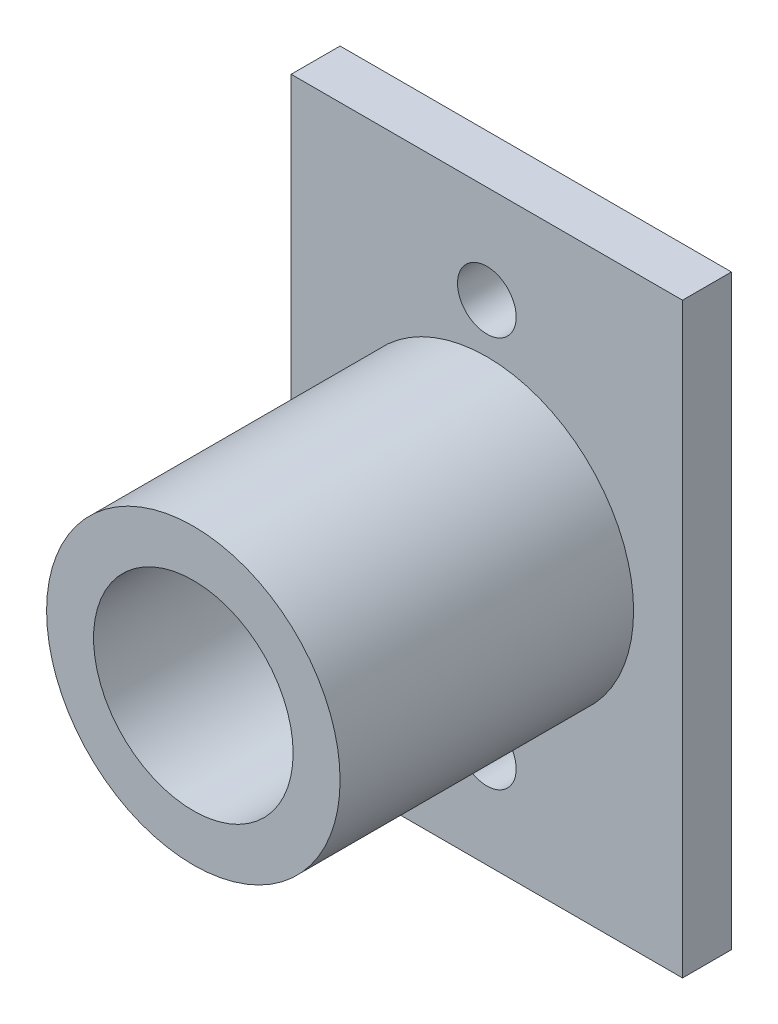
ISO-10303-21;
HEADER;
FILE_DESCRIPTION(('STEP AP214'),'2;1');
FILE_NAME('part.step','',(''),(''),'','','');
FILE_SCHEMA(('AUTOMOTIVE_DESIGN { 1 0 10303 214 1 1 1 1 }'));
ENDSEC;
DATA;
#1=APPLICATION_CONTEXT('core data for automotive mechanical design processes');
#2=APPLICATION_PROTOCOL_DEFINITION('international standard','automotive_design',2000,#1);
#3=PRODUCT_CONTEXT('',#1,'mechanical');
#4=PRODUCT('Part','Part','',(#3));
#5=PRODUCT_RELATED_PRODUCT_CATEGORY('part','',(#4));
#6=PRODUCT_DEFINITION_FORMATION('','',#4);
#7=PRODUCT_DEFINITION_CONTEXT('part definition',#1,'design');
#8=PRODUCT_DEFINITION('design','',#6,#7);
#9=PRODUCT_DEFINITION_SHAPE('','',#8);
#10=(LENGTH_UNIT() NAMED_UNIT(*) SI_UNIT(.MILLI.,.METRE.));
#11=(NAMED_UNIT(*) PLANE_ANGLE_UNIT() SI_UNIT($,.RADIAN.));
#12=(NAMED_UNIT(*) SI_UNIT($,.STERADIAN.) SOLID_ANGLE_UNIT());
#13=UNCERTAINTY_MEASURE_WITH_UNIT(LENGTH_MEASURE(1.E-05),#10,'distance_accuracy_value','');
#14=(GEOMETRIC_REPRESENTATION_CONTEXT(3) GLOBAL_UNCERTAINTY_ASSIGNED_CONTEXT((#13)) GLOBAL_UNIT_ASSIGNED_CONTEXT((#10,
#11,#12)) REPRESENTATION_CONTEXT('',''));
#15=CARTESIAN_POINT('',(0.,0.,0.));
#16=DIRECTION('',(0.,0.,1.));
#17=DIRECTION('',(1.,0.,0.));
#18=AXIS2_PLACEMENT_3D('',#15,#16,#17);
#19=CARTESIAN_POINT('',(-12.7,-19.05,3.175));
#20=DIRECTION('',(1.,0.,0.));
#21=DIRECTION('',(0.,0.,-1.));
#22=AXIS2_PLACEMENT_3D('',#19,#20,#21);
#23=PLANE('',#22);
#24=DIRECTION('',(0.,-1.,0.));
#25=VECTOR('',#24,1.);
#26=CARTESIAN_POINT('',(-12.7,-19.05,0.));
#27=LINE('',#26,#25);
#28=CARTESIAN_POINT('',(-12.7,19.05,0.));
#29=VERTEX_POINT('',#28);
#30=CARTESIAN_POINT('',(-12.7,-19.05,0.));
#31=VERTEX_POINT('',#30);
#32=EDGE_CURVE('E110',#29,#31,#27,.T.);
#33=ORIENTED_EDGE('',*,*,#32,.T.);
#34=DIRECTION('',(0.,0.,-1.));
#35=VECTOR('',#34,1.);
#36=CARTESIAN_POINT('',(-12.7,-19.05,3.175));
#37=LINE('',#36,#35);
#38=CARTESIAN_POINT('',(-12.7,-19.05,3.175));
#39=VERTEX_POINT('',#38);
#40=EDGE_CURVE('E42',#39,#31,#37,.T.);
#41=ORIENTED_EDGE('',*,*,#40,.F.);
#42=DIRECTION('',(0.,-1.,0.));
#43=VECTOR('',#42,1.);
#44=CARTESIAN_POINT('',(-12.7,-19.05,3.175));
#45=LINE('',#44,#43);
#46=CARTESIAN_POINT('',(-12.7,19.05,3.175));
#47=VERTEX_POINT('',#46);
#48=EDGE_CURVE('E93',#47,#39,#45,.T.);
#49=ORIENTED_EDGE('',*,*,#48,.F.);
#50=DIRECTION('',(0.,0.,-1.));
#51=VECTOR('',#50,1.);
#52=CARTESIAN_POINT('',(-12.7,19.05,3.175));
#53=LINE('',#52,#51);
#54=EDGE_CURVE('E106',#47,#29,#53,.T.);
#55=ORIENTED_EDGE('',*,*,#54,.T.);
#56=EDGE_LOOP('',(#33,#41,#49,#55));
#57=FACE_BOUND('',#56,.T.);
#58=ADVANCED_FACE('F39',(#57),#23,.F.);
#59=CARTESIAN_POINT('',(12.7,-19.05,3.175));
#60=DIRECTION('',(0.,1.,0.));
#61=DIRECTION('',(-1.,0.,0.));
#62=AXIS2_PLACEMENT_3D('',#59,#60,#61);
#63=PLANE('',#62);
#64=DIRECTION('',(1.,0.,0.));
#65=VECTOR('',#64,1.);
#66=CARTESIAN_POINT('',(12.7,-19.05,0.));
#67=LINE('',#66,#65);
#68=CARTESIAN_POINT('',(12.7,-19.05,0.));
#69=VERTEX_POINT('',#68);
#70=EDGE_CURVE('E99',#31,#69,#67,.T.);
#71=ORIENTED_EDGE('',*,*,#70,.T.);
#72=DIRECTION('',(0.,0.,-1.));
#73=VECTOR('',#72,1.);
#74=CARTESIAN_POINT('',(12.7,-19.05,3.175));
#75=LINE('',#74,#73);
#76=CARTESIAN_POINT('',(12.7,-19.05,3.175));
#77=VERTEX_POINT('',#76);
#78=EDGE_CURVE('E97',#77,#69,#75,.T.);
#79=ORIENTED_EDGE('',*,*,#78,.F.);
#80=DIRECTION('',(1.,0.,0.));
#81=VECTOR('',#80,1.);
#82=CARTESIAN_POINT('',(12.7,-19.05,3.175));
#83=LINE('',#82,#81);
#84=EDGE_CURVE('E88',#39,#77,#83,.T.);
#85=ORIENTED_EDGE('',*,*,#84,.F.);
#86=ORIENTED_EDGE('',*,*,#40,.T.);
#87=EDGE_LOOP('',(#71,#79,#85,#86));
#88=FACE_BOUND('',#87,.T.);
#89=ADVANCED_FACE('F98',(#88),#63,.F.);
#90=CARTESIAN_POINT('',(12.7,-19.05,3.175));
#91=DIRECTION('',(-1.,0.,0.));
#92=DIRECTION('',(0.,0.,1.));
#93=AXIS2_PLACEMENT_3D('',#90,#91,#92);
#94=PLANE('',#93);
#95=DIRECTION('',(0.,1.,0.));
#96=VECTOR('',#95,1.);
#97=CARTESIAN_POINT('',(12.7,-19.05,0.));
#98=LINE('',#97,#96);
#99=CARTESIAN_POINT('',(12.7,19.05,0.));
#100=VERTEX_POINT('',#99);
#101=EDGE_CURVE('E74',#69,#100,#98,.T.);
#102=ORIENTED_EDGE('',*,*,#101,.T.);
#103=DIRECTION('',(0.,0.,-1.));
#104=VECTOR('',#103,1.);
#105=CARTESIAN_POINT('',(12.7,19.05,3.175));
#106=LINE('',#105,#104);
#107=CARTESIAN_POINT('',(12.7,19.05,3.175));
#108=VERTEX_POINT('',#107);
#109=EDGE_CURVE('E101',#108,#100,#106,.T.);
#110=ORIENTED_EDGE('',*,*,#109,.F.);
#111=DIRECTION('',(0.,1.,0.));
#112=VECTOR('',#111,1.);
#113=CARTESIAN_POINT('',(12.7,-19.05,3.175));
#114=LINE('',#113,#112);
#115=EDGE_CURVE('E91',#77,#108,#114,.T.);
#116=ORIENTED_EDGE('',*,*,#115,.F.);
#117=ORIENTED_EDGE('',*,*,#78,.T.);
#118=EDGE_LOOP('',(#102,#110,#116,#117));
#119=FACE_BOUND('',#118,.T.);
#120=ADVANCED_FACE('F102',(#119),#94,.F.);
#121=CARTESIAN_POINT('',(12.7,19.05,3.175));
#122=DIRECTION('',(0.,-1.,0.));
#123=DIRECTION('',(1.,0.,0.));
#124=AXIS2_PLACEMENT_3D('',#121,#122,#123);
#125=PLANE('',#124);
#126=DIRECTION('',(-1.,0.,0.));
#127=VECTOR('',#126,1.);
#128=CARTESIAN_POINT('',(12.7,19.05,0.));
#129=LINE('',#128,#127);
#130=EDGE_CURVE('E80',#100,#29,#129,.T.);
#131=ORIENTED_EDGE('',*,*,#130,.T.);
#132=ORIENTED_EDGE('',*,*,#54,.F.);
#133=DIRECTION('',(-1.,0.,0.));
#134=VECTOR('',#133,1.);
#135=CARTESIAN_POINT('',(12.7,19.05,3.175));
#136=LINE('',#135,#134);
#137=EDGE_CURVE('E57',#108,#47,#136,.T.);
#138=ORIENTED_EDGE('',*,*,#137,.F.);
#139=ORIENTED_EDGE('',*,*,#109,.T.);
#140=EDGE_LOOP('',(#131,#132,#138,#139));
#141=FACE_BOUND('',#140,.T.);
#142=ADVANCED_FACE('F124',(#141),#125,.F.);
#143=CARTESIAN_POINT('',(0.,0.,3.175));
#144=DIRECTION('',(0.,0.,1.));
#145=DIRECTION('',(1.,0.,0.));
#146=AXIS2_PLACEMENT_3D('',#143,#144,#145);
#147=PLANE('',#146);
#148=CARTESIAN_POINT('',(0.,12.7,3.175));
#149=DIRECTION('',(0.,0.,1.));
#150=DIRECTION('',(1.,0.,0.));
#151=AXIS2_PLACEMENT_3D('',#148,#149,#150);
#152=CIRCLE('',#151,1.905);
#153=CARTESIAN_POINT('',(1.905,12.7,3.175));
#154=VERTEX_POINT('',#153);
#155=EDGE_CURVE('E151',#154,#154,#152,.T.);
#156=ORIENTED_EDGE('',*,*,#155,.F.);
#157=EDGE_LOOP('',(#156));
#158=FACE_BOUND('',#157,.T.);
#159=CARTESIAN_POINT('',(0.,-12.7,3.175));
#160=DIRECTION('',(0.,0.,1.));
#161=DIRECTION('',(1.,0.,0.));
#162=AXIS2_PLACEMENT_3D('',#159,#160,#161);
#163=CIRCLE('',#162,1.905);
#164=CARTESIAN_POINT('',(1.905,-12.7,3.175));
#165=VERTEX_POINT('',#164);
#166=EDGE_CURVE('E143',#165,#165,#163,.T.);
#167=ORIENTED_EDGE('',*,*,#166,.F.);
#168=EDGE_LOOP('',(#167));
#169=FACE_BOUND('',#168,.T.);
#170=CARTESIAN_POINT('',(0.,0.,3.175));
#171=DIRECTION('',(0.,0.,1.));
#172=DIRECTION('',(1.,0.,0.));
#173=AXIS2_PLACEMENT_3D('',#170,#171,#172);
#174=CIRCLE('',#173,9.525);
#175=CARTESIAN_POINT('',(-9.525,0.,3.175));
#176=VERTEX_POINT('',#175);
#177=EDGE_CURVE('E11',#176,#176,#174,.T.);
#178=ORIENTED_EDGE('',*,*,#177,.F.);
#179=EDGE_LOOP('',(#178));
#180=FACE_BOUND('',#179,.T.);
#181=ORIENTED_EDGE('',*,*,#48,.T.);
#182=ORIENTED_EDGE('',*,*,#84,.T.);
#183=ORIENTED_EDGE('',*,*,#115,.T.);
#184=ORIENTED_EDGE('',*,*,#137,.T.);
#185=EDGE_LOOP('',(#181,#182,#183,#184));
#186=FACE_BOUND('',#185,.T.);
#187=ADVANCED_FACE('F89',(#158,#169,#180,#186),#147,.T.);
#188=CARTESIAN_POINT('',(0.,0.,0.));
#189=DIRECTION('',(0.,0.,1.));
#190=DIRECTION('',(1.,0.,0.));
#191=AXIS2_PLACEMENT_3D('',#188,#189,#190);
#192=PLANE('',#191);
#193=CARTESIAN_POINT('',(0.,12.7,0.));
#194=DIRECTION('',(0.,0.,1.));
#195=DIRECTION('',(1.,0.,0.));
#196=AXIS2_PLACEMENT_3D('',#193,#194,#195);
#197=CIRCLE('',#196,1.905);
#198=CARTESIAN_POINT('',(1.905,12.7,0.));
#199=VERTEX_POINT('',#198);
#200=EDGE_CURVE('E139',#199,#199,#197,.T.);
#201=ORIENTED_EDGE('',*,*,#200,.T.);
#202=EDGE_LOOP('',(#201));
#203=FACE_BOUND('',#202,.T.);
#204=CARTESIAN_POINT('',(0.,-12.7,0.));
#205=DIRECTION('',(0.,0.,1.));
#206=DIRECTION('',(1.,0.,0.));
#207=AXIS2_PLACEMENT_3D('',#204,#205,#206);
#208=CIRCLE('',#207,1.905);
#209=CARTESIAN_POINT('',(1.905,-12.7,0.));
#210=VERTEX_POINT('',#209);
#211=EDGE_CURVE('E147',#210,#210,#208,.T.);
#212=ORIENTED_EDGE('',*,*,#211,.T.);
#213=EDGE_LOOP('',(#212));
#214=FACE_BOUND('',#213,.T.);
#215=CARTESIAN_POINT('',(0.,0.,0.));
#216=DIRECTION('',(0.,0.,1.));
#217=DIRECTION('',(1.,0.,0.));
#218=AXIS2_PLACEMENT_3D('',#215,#216,#217);
#219=CIRCLE('',#218,6.477);
#220=CARTESIAN_POINT('',(6.477,0.,0.));
#221=VERTEX_POINT('',#220);
#222=EDGE_CURVE('E134',#221,#221,#219,.T.);
#223=ORIENTED_EDGE('',*,*,#222,.T.);
#224=EDGE_LOOP('',(#223));
#225=FACE_BOUND('',#224,.T.);
#226=ORIENTED_EDGE('',*,*,#32,.F.);
#227=ORIENTED_EDGE('',*,*,#130,.F.);
#228=ORIENTED_EDGE('',*,*,#101,.F.);
#229=ORIENTED_EDGE('',*,*,#70,.F.);
#230=EDGE_LOOP('',(#226,#227,#228,#229));
#231=FACE_BOUND('',#230,.T.);
#232=ADVANCED_FACE('F127',(#203,#214,#225,#231),#192,.F.);
#233=CARTESIAN_POINT('',(0.,0.,22.225));
#234=DIRECTION('',(0.,0.,-1.));
#235=DIRECTION('',(-1.,0.,0.));
#236=AXIS2_PLACEMENT_3D('',#233,#234,#235);
#237=CYLINDRICAL_SURFACE('',#236,9.525);
#238=CARTESIAN_POINT('',(0.,0.,22.225));
#239=DIRECTION('',(0.,0.,1.));
#240=DIRECTION('',(1.,0.,0.));
#241=AXIS2_PLACEMENT_3D('',#238,#239,#240);
#242=CIRCLE('',#241,9.525);
#243=CARTESIAN_POINT('',(-9.525,0.,22.225));
#244=VERTEX_POINT('',#243);
#245=EDGE_CURVE('E114',#244,#244,#242,.T.);
#246=CARTESIAN_POINT('',(-9.525,0.,22.225));
#247=CARTESIAN_POINT('',(-9.525,0.,22.0265625));
#248=CARTESIAN_POINT('',(-9.525,0.,21.828125));
#249=CARTESIAN_POINT('',(-9.525,0.,21.43125));
#250=CARTESIAN_POINT('',(-9.525,0.,21.2328125));
#251=CARTESIAN_POINT('',(-9.525,0.,20.8359375));
#252=CARTESIAN_POINT('',(-9.525,0.,20.6375));
#253=CARTESIAN_POINT('',(-9.525,0.,20.240625));
#254=CARTESIAN_POINT('',(-9.525,0.,20.0421875));
#255=CARTESIAN_POINT('',(-9.525,0.,19.6453125));
#256=CARTESIAN_POINT('',(-9.525,0.,19.446875));
#257=CARTESIAN_POINT('',(-9.525,0.,19.05));
#258=CARTESIAN_POINT('',(-9.525,0.,18.8515625));
#259=CARTESIAN_POINT('',(-9.525,0.,18.4546875));
#260=CARTESIAN_POINT('',(-9.525,0.,18.25625));
#261=CARTESIAN_POINT('',(-9.525,0.,17.859375));
#262=CARTESIAN_POINT('',(-9.525,0.,17.6609375));
#263=CARTESIAN_POINT('',(-9.525,0.,17.2640625));
#264=CARTESIAN_POINT('',(-9.525,0.,17.065625));
#265=CARTESIAN_POINT('',(-9.525,0.,16.66875));
#266=CARTESIAN_POINT('',(-9.525,0.,16.4703125));
#267=CARTESIAN_POINT('',(-9.525,0.,16.0734375));
#268=CARTESIAN_POINT('',(-9.525,0.,15.875));
#269=CARTESIAN_POINT('',(-9.525,0.,15.478125));
#270=CARTESIAN_POINT('',(-9.525,0.,15.2796875));
#271=CARTESIAN_POINT('',(-9.525,0.,14.8828125));
#272=CARTESIAN_POINT('',(-9.525,0.,14.684375));
#273=CARTESIAN_POINT('',(-9.525,0.,14.2875));
#274=CARTESIAN_POINT('',(-9.525,0.,14.0890625));
#275=CARTESIAN_POINT('',(-9.525,0.,13.6921875));
#276=CARTESIAN_POINT('',(-9.525,0.,13.49375));
#277=CARTESIAN_POINT('',(-9.525,0.,13.096875));
#278=CARTESIAN_POINT('',(-9.525,0.,12.8984375));
#279=CARTESIAN_POINT('',(-9.525,0.,12.5015625));
#280=CARTESIAN_POINT('',(-9.525,0.,12.303125));
#281=CARTESIAN_POINT('',(-9.525,0.,11.90625));
#282=CARTESIAN_POINT('',(-9.525,0.,11.7078125));
#283=CARTESIAN_POINT('',(-9.525,0.,11.3109375));
#284=CARTESIAN_POINT('',(-9.525,0.,11.1125));
#285=CARTESIAN_POINT('',(-9.525,0.,10.715625));
#286=CARTESIAN_POINT('',(-9.525,0.,10.5171875));
#287=CARTESIAN_POINT('',(-9.525,0.,10.1203125));
#288=CARTESIAN_POINT('',(-9.525,0.,9.921875));
#289=CARTESIAN_POINT('',(-9.525,0.,9.525));
#290=CARTESIAN_POINT('',(-9.525,0.,9.3265625));
#291=CARTESIAN_POINT('',(-9.525,0.,8.9296875));
#292=CARTESIAN_POINT('',(-9.525,0.,8.73125));
#293=CARTESIAN_POINT('',(-9.525,0.,8.334375));
#294=CARTESIAN_POINT('',(-9.525,0.,8.1359375));
#295=CARTESIAN_POINT('',(-9.525,0.,7.7390625));
#296=CARTESIAN_POINT('',(-9.525,0.,7.540625));
#297=CARTESIAN_POINT('',(-9.525,0.,7.14375));
#298=CARTESIAN_POINT('',(-9.525,0.,6.9453125));
#299=CARTESIAN_POINT('',(-9.525,0.,6.5484375));
#300=CARTESIAN_POINT('',(-9.525,0.,6.35));
#301=CARTESIAN_POINT('',(-9.525,0.,5.953125));
#302=CARTESIAN_POINT('',(-9.525,0.,5.7546875));
#303=CARTESIAN_POINT('',(-9.525,0.,5.3578125));
#304=CARTESIAN_POINT('',(-9.525,0.,5.159375));
#305=CARTESIAN_POINT('',(-9.525,0.,4.7625));
#306=CARTESIAN_POINT('',(-9.525,0.,4.5640625));
#307=CARTESIAN_POINT('',(-9.525,0.,4.1671875));
#308=CARTESIAN_POINT('',(-9.525,0.,3.96875));
#309=CARTESIAN_POINT('',(-9.525,0.,3.571875));
#310=CARTESIAN_POINT('',(-9.525,0.,3.3734375));
#311=CARTESIAN_POINT('',(-9.525,0.,3.175));
#312=B_SPLINE_CURVE_WITH_KNOTS('',3,(#246,#247,#248,#249,#250,#251,#252,#253,#254,#255,#256,
#257,#258,#259,#260,#261,#262,#263,#264,#265,#266,#267,#268,#269,#270,#271,#272,#273,#274,#275,
#276,#277,#278,#279,#280,#281,#282,#283,#284,#285,#286,#287,#288,#289,#290,#291,#292,#293,#294,
#295,#296,#297,#298,#299,#300,#301,#302,#303,#304,#305,#306,#307,#308,#309,#310,#311),
.UNSPECIFIED.,.F.,.F.,(4,2,2,2,2,2,2,2,2,2,2,2,2,2,2,2,2,2,2,2,2,2,2,2,2,2,2,2,2,2,2,2,4),(0.,
0.5953125,1.190625,1.7859375,2.38125,2.9765625,3.571875,4.1671875,4.7625,5.3578125,5.953125,
6.5484375,7.14375,7.7390625,8.334375,8.9296875,9.525,10.1203125,10.715625,11.3109375,11.90625,
12.5015625,13.096875,13.6921875,14.2875,14.8828125,15.478125,16.0734375,16.66875,17.2640625,
17.859375,18.4546875,19.05),.UNSPECIFIED.);
#313=EDGE_CURVE('BSEAM175',#244,#176,#312,.T.);
#314=ORIENTED_EDGE('',*,*,#245,.F.);
#315=ORIENTED_EDGE('',*,*,#177,.T.);
#316=ORIENTED_EDGE('',*,*,#313,.T.);
#317=ORIENTED_EDGE('',*,*,#313,.F.);
#318=EDGE_LOOP('',(#314,#316,#315,#317));
#319=FACE_BOUND('',#318,.T.);
#320=ADVANCED_FACE('F175',(#319),#237,.T.);
#321=CARTESIAN_POINT('',(0.,0.,22.225));
#322=DIRECTION('',(0.,0.,1.));
#323=DIRECTION('',(1.,0.,0.));
#324=AXIS2_PLACEMENT_3D('',#321,#322,#323);
#325=PLANE('',#324);
#326=CARTESIAN_POINT('',(0.,0.,22.225));
#327=DIRECTION('',(0.,0.,1.));
#328=DIRECTION('',(1.,0.,0.));
#329=AXIS2_PLACEMENT_3D('',#326,#327,#328);
#330=CIRCLE('',#329,6.477);
#331=CARTESIAN_POINT('',(6.477,0.,22.225));
#332=VERTEX_POINT('',#331);
#333=EDGE_CURVE('E135',#332,#332,#330,.T.);
#334=ORIENTED_EDGE('',*,*,#333,.F.);
#335=EDGE_LOOP('',(#334));
#336=FACE_BOUND('',#335,.T.);
#337=ORIENTED_EDGE('',*,*,#245,.T.);
#338=EDGE_LOOP('',(#337));
#339=FACE_BOUND('',#338,.T.);
#340=ADVANCED_FACE('F177',(#336,#339),#325,.T.);
#341=CARTESIAN_POINT('',(0.,0.,0.));
#342=DIRECTION('',(0.,0.,1.));
#343=DIRECTION('',(1.,0.,0.));
#344=AXIS2_PLACEMENT_3D('',#341,#342,#343);
#345=CYLINDRICAL_SURFACE('',#344,6.477);
#346=ORIENTED_EDGE('',*,*,#222,.F.);
#347=EDGE_LOOP('',(#346));
#348=FACE_BOUND('',#347,.T.);
#349=ORIENTED_EDGE('',*,*,#333,.T.);
#350=EDGE_LOOP('',(#349));
#351=FACE_BOUND('',#350,.T.);
#352=ADVANCED_FACE('F184',(#348,#351),#345,.F.);
#353=CARTESIAN_POINT('',(0.,-12.7,0.));
#354=DIRECTION('',(0.,0.,1.));
#355=DIRECTION('',(1.,0.,0.));
#356=AXIS2_PLACEMENT_3D('',#353,#354,#355);
#357=CYLINDRICAL_SURFACE('',#356,1.905);
#358=ORIENTED_EDGE('',*,*,#211,.F.);
#359=EDGE_LOOP('',(#358));
#360=FACE_BOUND('',#359,.T.);
#361=ORIENTED_EDGE('',*,*,#166,.T.);
#362=EDGE_LOOP('',(#361));
#363=FACE_BOUND('',#362,.T.);
#364=ADVANCED_FACE('F164',(#360,#363),#357,.F.);
#365=CARTESIAN_POINT('',(0.,12.7,0.));
#366=DIRECTION('',(0.,0.,1.));
#367=DIRECTION('',(1.,0.,0.));
#368=AXIS2_PLACEMENT_3D('',#365,#366,#367);
#369=CYLINDRICAL_SURFACE('',#368,1.905);
#370=ORIENTED_EDGE('',*,*,#200,.F.);
#371=EDGE_LOOP('',(#370));
#372=FACE_BOUND('',#371,.T.);
#373=ORIENTED_EDGE('',*,*,#155,.T.);
#374=EDGE_LOOP('',(#373));
#375=FACE_BOUND('',#374,.T.);
#376=ADVANCED_FACE('F161',(#372,#375),#369,.F.);
#377=CLOSED_SHELL('',(#58,#89,#120,#142,#187,#232,#320,#340,#352,#364,#376));
#378=MANIFOLD_SOLID_BREP('B2',#377);
#379=ADVANCED_BREP_SHAPE_REPRESENTATION('',(#18,#378),#14);
#380=SHAPE_DEFINITION_REPRESENTATION(#9,#379);
ENDSEC;
END-ISO-10303-21;
